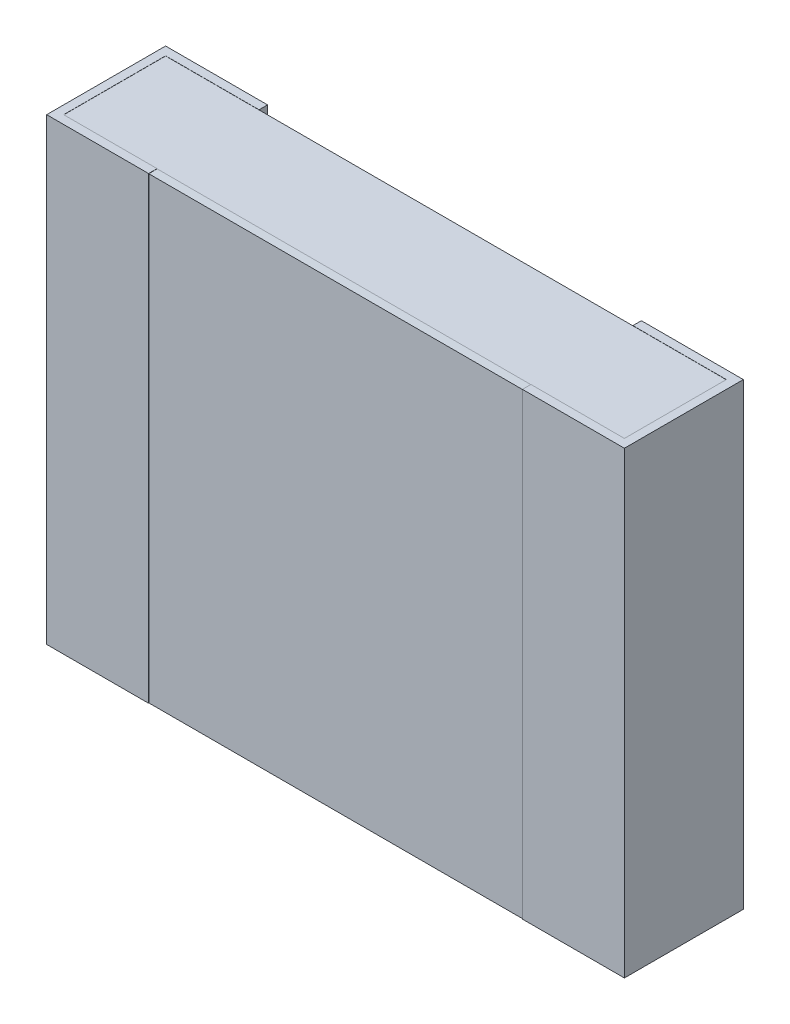
ISO-10303-21;
HEADER;
FILE_DESCRIPTION(('STEP AP214'),'2;1');
FILE_NAME('part.step','',(''),(''),'','','');
FILE_SCHEMA(('AUTOMOTIVE_DESIGN { 1 0 10303 214 1 1 1 1 }'));
ENDSEC;
DATA;
#1=APPLICATION_CONTEXT('core data for automotive mechanical design processes');
#2=APPLICATION_PROTOCOL_DEFINITION('international standard','automotive_design',2000,#1);
#3=PRODUCT_CONTEXT('',#1,'mechanical');
#4=PRODUCT('Part','Part','',(#3));
#5=PRODUCT_RELATED_PRODUCT_CATEGORY('part','',(#4));
#6=PRODUCT_DEFINITION_FORMATION('','',#4);
#7=PRODUCT_DEFINITION_CONTEXT('part definition',#1,'design');
#8=PRODUCT_DEFINITION('design','',#6,#7);
#9=PRODUCT_DEFINITION_SHAPE('','',#8);
#10=(LENGTH_UNIT() NAMED_UNIT(*) SI_UNIT(.MILLI.,.METRE.));
#11=(NAMED_UNIT(*) PLANE_ANGLE_UNIT() SI_UNIT($,.RADIAN.));
#12=(NAMED_UNIT(*) SI_UNIT($,.STERADIAN.) SOLID_ANGLE_UNIT());
#13=UNCERTAINTY_MEASURE_WITH_UNIT(LENGTH_MEASURE(1.E-05),#10,'distance_accuracy_value','');
#14=(GEOMETRIC_REPRESENTATION_CONTEXT(3) GLOBAL_UNCERTAINTY_ASSIGNED_CONTEXT((#13)) GLOBAL_UNIT_ASSIGNED_CONTEXT((#10,
#11,#12)) REPRESENTATION_CONTEXT('',''));
#15=CARTESIAN_POINT('',(0.,0.,0.));
#16=DIRECTION('',(0.,0.,1.));
#17=DIRECTION('',(1.,0.,0.));
#18=AXIS2_PLACEMENT_3D('',#15,#16,#17);
#19=CARTESIAN_POINT('',(-400000.,1.35,0.699999999995));
#20=DIRECTION('',(0.,0.,-1.));
#21=DIRECTION('',(-1.,0.,0.));
#22=AXIS2_PLACEMENT_3D('',#19,#20,#21);
#23=PLANE('',#22);
#24=DIRECTION('',(0.,1.,0.));
#25=VECTOR('',#24,1.);
#26=CARTESIAN_POINT('',(1.700000000028,1.35,0.699999999994816));
#27=LINE('',#26,#25);
#28=CARTESIAN_POINT('',(1.700000000028,-1.35,0.699999999994877));
#29=VERTEX_POINT('',#28);
#30=CARTESIAN_POINT('',(1.700000000028,1.35,0.699999999994877));
#31=VERTEX_POINT('',#30);
#32=EDGE_CURVE('E303',#29,#31,#27,.T.);
#33=ORIENTED_EDGE('',*,*,#32,.T.);
#34=DIRECTION('',(-1.,0.,0.));
#35=VECTOR('',#34,1.);
#36=CARTESIAN_POINT('',(-400000.,1.35,0.699999999995));
#37=LINE('',#36,#35);
#38=CARTESIAN_POINT('',(1.10000000000803,1.35,0.699999999994877));
#39=VERTEX_POINT('',#38);
#40=EDGE_CURVE('E154',#39,#31,#37,.F.);
#41=ORIENTED_EDGE('',*,*,#40,.F.);
#42=DIRECTION('',(0.,1.,0.));
#43=VECTOR('',#42,1.);
#44=CARTESIAN_POINT('',(1.100000000008,1.35,0.699999999994816));
#45=LINE('',#44,#43);
#46=CARTESIAN_POINT('',(1.10000000000803,-1.35,0.699999999994877));
#47=VERTEX_POINT('',#46);
#48=EDGE_CURVE('E242',#39,#47,#45,.F.);
#49=ORIENTED_EDGE('',*,*,#48,.T.);
#50=DIRECTION('',(-1.,0.,0.));
#51=VECTOR('',#50,1.);
#52=CARTESIAN_POINT('',(-400000.,-1.35,0.699999999995));
#53=LINE('',#52,#51);
#54=EDGE_CURVE('E161',#29,#47,#53,.T.);
#55=ORIENTED_EDGE('',*,*,#54,.F.);
#56=EDGE_LOOP('',(#33,#41,#49,#55));
#57=FACE_BOUND('',#56,.T.);
#58=ADVANCED_FACE('F17',(#57),#23,.F.);
#59=CARTESIAN_POINT('',(1.100000000008,1.35,291599.965));
#60=DIRECTION('',(1.,0.,0.));
#61=DIRECTION('',(0.,0.,-1.));
#62=AXIS2_PLACEMENT_3D('',#59,#60,#61);
#63=PLANE('',#62);
#64=DIRECTION('',(0.,1.,0.));
#65=VECTOR('',#64,1.);
#66=CARTESIAN_POINT('',(1.10000000000809,1.348,0.698999999997));
#67=LINE('',#66,#65);
#68=CARTESIAN_POINT('',(1.10000000000801,1.34851000000005,0.698999999997171));
#69=VERTEX_POINT('',#68);
#70=CARTESIAN_POINT('',(1.1000000001028,-1.34851000000004,0.698999999997114));
#71=VERTEX_POINT('',#70);
#72=EDGE_CURVE('E200',#69,#71,#67,.F.);
#73=ORIENTED_EDGE('',*,*,#72,.T.);
#74=DIRECTION('',(0.,0.00999950003953646,0.999950003749667));
#75=VECTOR('',#74,1.);
#76=CARTESIAN_POINT('',(1.100000000008,-1.349,0.650000000007367));
#77=LINE('',#76,#75);
#78=CARTESIAN_POINT('',(1.10000000000805,-1.349,0.650000000007));
#79=VERTEX_POINT('',#78);
#80=EDGE_CURVE('E206',#79,#71,#77,.T.);
#81=ORIENTED_EDGE('',*,*,#80,.F.);
#82=DIRECTION('',(0.,1.,0.));
#83=VECTOR('',#82,1.);
#84=CARTESIAN_POINT('',(1.10000000000809,1.35,0.650000000007));
#85=LINE('',#84,#83);
#86=CARTESIAN_POINT('',(1.10000000000805,-1.35,0.650000000007092));
#87=VERTEX_POINT('',#86);
#88=EDGE_CURVE('E288',#87,#79,#85,.T.);
#89=ORIENTED_EDGE('',*,*,#88,.F.);
#90=DIRECTION('',(0.,0.,-1.));
#91=VECTOR('',#90,1.);
#92=CARTESIAN_POINT('',(1.100000000008,-1.35,291599.965));
#93=LINE('',#92,#91);
#94=EDGE_CURVE('E244',#47,#87,#93,.T.);
#95=ORIENTED_EDGE('',*,*,#94,.F.);
#96=ORIENTED_EDGE('',*,*,#48,.F.);
#97=DIRECTION('',(0.,0.,-1.));
#98=VECTOR('',#97,1.);
#99=CARTESIAN_POINT('',(1.100000000008,1.35,291599.965));
#100=LINE('',#99,#98);
#101=CARTESIAN_POINT('',(1.10000000000807,1.35,0.650000000007092));
#102=VERTEX_POINT('',#101);
#103=EDGE_CURVE('E147',#102,#39,#100,.F.);
#104=ORIENTED_EDGE('',*,*,#103,.F.);
#105=DIRECTION('',(0.,1.,0.));
#106=VECTOR('',#105,1.);
#107=CARTESIAN_POINT('',(1.10000000000809,1.35,0.650000000007));
#108=LINE('',#107,#106);
#109=CARTESIAN_POINT('',(1.10000000000805,1.349,0.650000000007));
#110=VERTEX_POINT('',#109);
#111=EDGE_CURVE('E20',#110,#102,#108,.T.);
#112=ORIENTED_EDGE('',*,*,#111,.F.);
#113=DIRECTION('',(0.,0.00999950003954089,-0.999950003749667));
#114=VECTOR('',#113,1.);
#115=CARTESIAN_POINT('',(1.100000000008,1.34851,0.698999999997341));
#116=LINE('',#115,#114);
#117=EDGE_CURVE('E197',#69,#110,#116,.T.);
#118=ORIENTED_EDGE('',*,*,#117,.F.);
#119=EDGE_LOOP('',(#73,#81,#89,#95,#96,#104,#112,#118));
#120=FACE_BOUND('',#119,.T.);
#121=ADVANCED_FACE('F199',(#120),#63,.F.);
#122=CARTESIAN_POINT('',(-1.100000000008,1.35,291599.965));
#123=DIRECTION('',(-1.,0.,0.));
#124=DIRECTION('',(0.,0.,1.));
#125=AXIS2_PLACEMENT_3D('',#122,#123,#124);
#126=PLANE('',#125);
#127=DIRECTION('',(0.,-0.00999950003954089,0.999950003749667));
#128=VECTOR('',#127,1.);
#129=CARTESIAN_POINT('',(-1.100000000008,1.349,0.650000000007367));
#130=LINE('',#129,#128);
#131=CARTESIAN_POINT('',(-1.10000000000805,1.349,0.650000000007));
#132=VERTEX_POINT('',#131);
#133=CARTESIAN_POINT('',(-1.100000000008,1.34851,0.698999999997341));
#134=VERTEX_POINT('',#133);
#135=EDGE_CURVE('E219',#132,#134,#130,.T.);
#136=ORIENTED_EDGE('',*,*,#135,.F.);
#137=DIRECTION('',(0.,1.,0.));
#138=VECTOR('',#137,1.);
#139=CARTESIAN_POINT('',(-1.10000000000809,1.35,0.650000000007));
#140=LINE('',#139,#138);
#141=CARTESIAN_POINT('',(-1.10000000000805,1.35,0.650000000007092));
#142=VERTEX_POINT('',#141);
#143=EDGE_CURVE('E281',#142,#132,#140,.F.);
#144=ORIENTED_EDGE('',*,*,#143,.F.);
#145=DIRECTION('',(0.,0.,1.));
#146=VECTOR('',#145,1.);
#147=CARTESIAN_POINT('',(-1.100000000008,1.35,291599.965));
#148=LINE('',#147,#146);
#149=CARTESIAN_POINT('',(-1.10000000000806,1.35,0.699999999994939));
#150=VERTEX_POINT('',#149);
#151=EDGE_CURVE('E284',#150,#142,#148,.F.);
#152=ORIENTED_EDGE('',*,*,#151,.F.);
#153=DIRECTION('',(0.,1.,0.));
#154=VECTOR('',#153,1.);
#155=CARTESIAN_POINT('',(-1.10000000000809,1.35,0.699999999995));
#156=LINE('',#155,#154);
#157=CARTESIAN_POINT('',(-1.10000000000806,-1.35,0.699999999994939));
#158=VERTEX_POINT('',#157);
#159=EDGE_CURVE('E314',#150,#158,#156,.F.);
#160=ORIENTED_EDGE('',*,*,#159,.T.);
#161=DIRECTION('',(0.,0.,1.));
#162=VECTOR('',#161,1.);
#163=CARTESIAN_POINT('',(-1.100000000008,-1.35,291599.965));
#164=LINE('',#163,#162);
#165=CARTESIAN_POINT('',(-1.10000000000805,-1.35,0.650000000007092));
#166=VERTEX_POINT('',#165);
#167=EDGE_CURVE('E287',#166,#158,#164,.T.);
#168=ORIENTED_EDGE('',*,*,#167,.F.);
#169=DIRECTION('',(0.,1.,0.));
#170=VECTOR('',#169,1.);
#171=CARTESIAN_POINT('',(-1.10000000000809,1.35,0.650000000007));
#172=LINE('',#171,#170);
#173=CARTESIAN_POINT('',(-1.10000000000805,-1.349,0.650000000007));
#174=VERTEX_POINT('',#173);
#175=EDGE_CURVE('E285',#174,#166,#172,.F.);
#176=ORIENTED_EDGE('',*,*,#175,.F.);
#177=DIRECTION('',(0.,-0.00999950003953646,-0.999950003749667));
#178=VECTOR('',#177,1.);
#179=CARTESIAN_POINT('',(-1.100000000008,-1.34851,0.698999999997341));
#180=LINE('',#179,#178);
#181=CARTESIAN_POINT('',(-1.10000000000805,-1.34851000000001,0.69899999999717));
#182=VERTEX_POINT('',#181);
#183=EDGE_CURVE('E205',#182,#174,#180,.T.);
#184=ORIENTED_EDGE('',*,*,#183,.F.);
#185=DIRECTION('',(0.,1.,0.));
#186=VECTOR('',#185,1.);
#187=CARTESIAN_POINT('',(-1.10000000000809,1.348,0.698999999997));
#188=LINE('',#187,#186);
#189=EDGE_CURVE('E215',#182,#134,#188,.T.);
#190=ORIENTED_EDGE('',*,*,#189,.T.);
#191=EDGE_LOOP('',(#136,#144,#152,#160,#168,#176,#184,#190));
#192=FACE_BOUND('',#191,.T.);
#193=ADVANCED_FACE('F376',(#192),#126,.F.);
#194=CARTESIAN_POINT('',(-400000.,1.35,0.699999999995));
#195=DIRECTION('',(0.,0.,-1.));
#196=DIRECTION('',(-1.,0.,0.));
#197=AXIS2_PLACEMENT_3D('',#194,#195,#196);
#198=PLANE('',#197);
#199=ORIENTED_EDGE('',*,*,#159,.F.);
#200=DIRECTION('',(-1.,0.,0.));
#201=VECTOR('',#200,1.);
#202=CARTESIAN_POINT('',(-400000.,1.35,0.699999999995));
#203=LINE('',#202,#201);
#204=CARTESIAN_POINT('',(-1.700000000028,1.35,0.699999999994939));
#205=VERTEX_POINT('',#204);
#206=EDGE_CURVE('E317',#205,#150,#203,.F.);
#207=ORIENTED_EDGE('',*,*,#206,.F.);
#208=DIRECTION('',(0.,1.,0.));
#209=VECTOR('',#208,1.);
#210=CARTESIAN_POINT('',(-1.700000000028,1.35,0.699999999994816));
#211=LINE('',#210,#209);
#212=CARTESIAN_POINT('',(-1.700000000028,-1.35,0.699999999994877));
#213=VERTEX_POINT('',#212);
#214=EDGE_CURVE('E319',#205,#213,#211,.F.);
#215=ORIENTED_EDGE('',*,*,#214,.T.);
#216=DIRECTION('',(-1.,0.,0.));
#217=VECTOR('',#216,1.);
#218=CARTESIAN_POINT('',(-400000.,-1.35,0.699999999995));
#219=LINE('',#218,#217);
#220=EDGE_CURVE('E180',#158,#213,#219,.T.);
#221=ORIENTED_EDGE('',*,*,#220,.F.);
#222=EDGE_LOOP('',(#199,#207,#215,#221));
#223=FACE_BOUND('',#222,.T.);
#224=ADVANCED_FACE('F806',(#223),#198,.F.);
#225=CARTESIAN_POINT('',(1.700000000028,1.35,291599.965));
#226=DIRECTION('',(-1.,0.,0.));
#227=DIRECTION('',(0.,0.,1.));
#228=AXIS2_PLACEMENT_3D('',#225,#226,#227);
#229=PLANE('',#228);
#230=DIRECTION('',(0.,1.,0.));
#231=VECTOR('',#230,1.);
#232=CARTESIAN_POINT('',(1.70000000002801,1.35,0.));
#233=LINE('',#232,#231);
#234=CARTESIAN_POINT('',(1.700000000028,-1.35,0.));
#235=VERTEX_POINT('',#234);
#236=CARTESIAN_POINT('',(1.700000000028,1.35,0.));
#237=VERTEX_POINT('',#236);
#238=EDGE_CURVE('E278',#235,#237,#233,.T.);
#239=ORIENTED_EDGE('',*,*,#238,.T.);
#240=DIRECTION('',(0.,0.,1.));
#241=VECTOR('',#240,1.);
#242=CARTESIAN_POINT('',(1.700000000028,1.35,291599.965));
#243=LINE('',#242,#241);
#244=EDGE_CURVE('E305',#31,#237,#243,.F.);
#245=ORIENTED_EDGE('',*,*,#244,.F.);
#246=ORIENTED_EDGE('',*,*,#32,.F.);
#247=DIRECTION('',(0.,0.,1.));
#248=VECTOR('',#247,1.);
#249=CARTESIAN_POINT('',(1.700000000028,-1.35,291599.965));
#250=LINE('',#249,#248);
#251=EDGE_CURVE('E216',#235,#29,#250,.T.);
#252=ORIENTED_EDGE('',*,*,#251,.F.);
#253=EDGE_LOOP('',(#239,#245,#246,#252));
#254=FACE_BOUND('',#253,.T.);
#255=ADVANCED_FACE('F755',(#254),#229,.F.);
#256=CARTESIAN_POINT('',(-400000.,1.348,0.698999999997));
#257=DIRECTION('',(0.,0.,-1.));
#258=DIRECTION('',(-1.,0.,0.));
#259=AXIS2_PLACEMENT_3D('',#256,#257,#258);
#260=PLANE('',#259);
#261=DIRECTION('',(1.,0.,0.));
#262=VECTOR('',#261,1.);
#263=CARTESIAN_POINT('',(-400000.,-1.3485100000001,0.698999999997001));
#264=LINE('',#263,#262);
#265=EDGE_CURVE('E214',#71,#182,#264,.F.);
#266=ORIENTED_EDGE('',*,*,#265,.F.);
#267=ORIENTED_EDGE('',*,*,#72,.F.);
#268=DIRECTION('',(1.,0.,0.));
#269=VECTOR('',#268,1.);
#270=CARTESIAN_POINT('',(-1.100000000025,1.3485100000001,0.698999999997001));
#271=LINE('',#270,#269);
#272=EDGE_CURVE('E212',#69,#134,#271,.F.);
#273=ORIENTED_EDGE('',*,*,#272,.T.);
#274=ORIENTED_EDGE('',*,*,#189,.F.);
#275=EDGE_LOOP('',(#266,#267,#273,#274));
#276=FACE_BOUND('',#275,.T.);
#277=ADVANCED_FACE('F210',(#276),#260,.F.);
#278=CARTESIAN_POINT('',(-1.700000000028,1.35,291599.965));
#279=DIRECTION('',(1.,0.,0.));
#280=DIRECTION('',(0.,0.,-1.));
#281=AXIS2_PLACEMENT_3D('',#278,#279,#280);
#282=PLANE('',#281);
#283=ORIENTED_EDGE('',*,*,#214,.F.);
#284=DIRECTION('',(0.,0.,-1.));
#285=VECTOR('',#284,1.);
#286=CARTESIAN_POINT('',(-1.700000000028,1.35,0.650000000007));
#287=LINE('',#286,#285);
#288=CARTESIAN_POINT('',(-1.70000000002801,1.35,0.));
#289=VERTEX_POINT('',#288);
#290=EDGE_CURVE('E263',#205,#289,#287,.T.);
#291=ORIENTED_EDGE('',*,*,#290,.T.);
#292=DIRECTION('',(0.,1.,0.));
#293=VECTOR('',#292,1.);
#294=CARTESIAN_POINT('',(-1.70000000002801,1.35,0.));
#295=LINE('',#294,#293);
#296=CARTESIAN_POINT('',(-1.700000000028,-1.35,0.));
#297=VERTEX_POINT('',#296);
#298=EDGE_CURVE('E406',#289,#297,#295,.F.);
#299=ORIENTED_EDGE('',*,*,#298,.T.);
#300=DIRECTION('',(0.,0.,-1.));
#301=VECTOR('',#300,1.);
#302=CARTESIAN_POINT('',(-1.700000000028,-1.35,291599.965));
#303=LINE('',#302,#301);
#304=EDGE_CURVE('E280',#213,#297,#303,.T.);
#305=ORIENTED_EDGE('',*,*,#304,.F.);
#306=EDGE_LOOP('',(#283,#291,#299,#305));
#307=FACE_BOUND('',#306,.T.);
#308=ADVANCED_FACE('F556',(#307),#282,.F.);
#309=CARTESIAN_POINT('',(-1.649999999984,1.35,291599.965));
#310=DIRECTION('',(-1.,0.,0.));
#311=DIRECTION('',(0.,0.,1.));
#312=AXIS2_PLACEMENT_3D('',#309,#310,#311);
#313=PLANE('',#312);
#314=DIRECTION('',(0.,0.,1.));
#315=VECTOR('',#314,1.);
#316=CARTESIAN_POINT('',(-1.649999999984,-1.349,0.04999999998745));
#317=LINE('',#316,#315);
#318=CARTESIAN_POINT('',(-1.649999999984,-1.349,0.0499999999874495));
#319=VERTEX_POINT('',#318);
#320=CARTESIAN_POINT('',(-1.649999999984,-1.349,0.650000000007183));
#321=VERTEX_POINT('',#320);
#322=EDGE_CURVE('E387',#319,#321,#317,.T.);
#323=ORIENTED_EDGE('',*,*,#322,.T.);
#324=DIRECTION('',(0.,1.,0.));
#325=VECTOR('',#324,1.);
#326=CARTESIAN_POINT('',(-1.649999999984,1.35,0.650000000007367));
#327=LINE('',#326,#325);
#328=CARTESIAN_POINT('',(-1.649999999984,-1.35,0.650000000007183));
#329=VERTEX_POINT('',#328);
#330=EDGE_CURVE('E237',#321,#329,#327,.F.);
#331=ORIENTED_EDGE('',*,*,#330,.T.);
#332=DIRECTION('',(0.,0.,-1.));
#333=VECTOR('',#332,1.);
#334=CARTESIAN_POINT('',(-1.649999999984,-1.35,0.650000000007));
#335=LINE('',#334,#333);
#336=CARTESIAN_POINT('',(-1.649999999984,-1.35,0.0499999999874495));
#337=VERTEX_POINT('',#336);
#338=EDGE_CURVE('E399',#337,#329,#335,.F.);
#339=ORIENTED_EDGE('',*,*,#338,.F.);
#340=DIRECTION('',(0.,1.,0.));
#341=VECTOR('',#340,1.);
#342=CARTESIAN_POINT('',(-1.649999999984,1.35,0.049999999987449));
#343=LINE('',#342,#341);
#344=EDGE_CURVE('E264',#337,#319,#343,.T.);
#345=ORIENTED_EDGE('',*,*,#344,.T.);
#346=EDGE_LOOP('',(#323,#331,#339,#345));
#347=FACE_BOUND('',#346,.T.);
#348=ADVANCED_FACE('F554',(#347),#313,.F.);
#349=CARTESIAN_POINT('',(-400000.,1.35,0.650000000007));
#350=DIRECTION('',(0.,0.,1.));
#351=DIRECTION('',(1.,0.,0.));
#352=AXIS2_PLACEMENT_3D('',#349,#350,#351);
#353=PLANE('',#352);
#354=DIRECTION('',(1.,0.,0.));
#355=VECTOR('',#354,1.);
#356=CARTESIAN_POINT('',(-1.649999999984,-1.349,0.650000000007));
#357=LINE('',#356,#355);
#358=EDGE_CURVE('E382',#321,#174,#357,.T.);
#359=ORIENTED_EDGE('',*,*,#358,.T.);
#360=ORIENTED_EDGE('',*,*,#175,.T.);
#361=DIRECTION('',(1.,0.,0.));
#362=VECTOR('',#361,1.);
#363=CARTESIAN_POINT('',(-1.649999999984,-1.35,0.650000000007));
#364=LINE('',#363,#362);
#365=EDGE_CURVE('E403',#329,#166,#364,.T.);
#366=ORIENTED_EDGE('',*,*,#365,.F.);
#367=ORIENTED_EDGE('',*,*,#330,.F.);
#368=EDGE_LOOP('',(#359,#360,#366,#367));
#369=FACE_BOUND('',#368,.T.);
#370=ADVANCED_FACE('F383',(#369),#353,.F.);
#371=CARTESIAN_POINT('',(-400000.,-1.349,0.650000000007));
#372=DIRECTION('',(0.,-0.999950003749688,0.00999950003749088));
#373=DIRECTION('',(0.,-0.00999950003749088,-0.999950003749688));
#374=AXIS2_PLACEMENT_3D('',#371,#372,#373);
#375=PLANE('',#374);
#376=ORIENTED_EDGE('',*,*,#183,.T.);
#377=DIRECTION('',(1.,0.,0.));
#378=VECTOR('',#377,1.);
#379=CARTESIAN_POINT('',(-1.649999999984,-1.349,0.650000000007));
#380=LINE('',#379,#378);
#381=EDGE_CURVE('E374',#174,#79,#380,.T.);
#382=ORIENTED_EDGE('',*,*,#381,.T.);
#383=ORIENTED_EDGE('',*,*,#80,.T.);
#384=ORIENTED_EDGE('',*,*,#265,.T.);
#385=EDGE_LOOP('',(#376,#382,#383,#384));
#386=FACE_BOUND('',#385,.T.);
#387=ADVANCED_FACE('F372',(#386),#375,.T.);
#388=CARTESIAN_POINT('',(-400000.,1.35,0.650000000007));
#389=DIRECTION('',(0.,0.,1.));
#390=DIRECTION('',(1.,0.,0.));
#391=AXIS2_PLACEMENT_3D('',#388,#389,#390);
#392=PLANE('',#391);
#393=DIRECTION('',(1.,0.,0.));
#394=VECTOR('',#393,1.);
#395=CARTESIAN_POINT('',(-1.649999999984,-1.349,0.650000000007));
#396=LINE('',#395,#394);
#397=CARTESIAN_POINT('',(1.64999999998386,-1.349,0.650000000007));
#398=VERTEX_POINT('',#397);
#399=EDGE_CURVE('E391',#79,#398,#396,.T.);
#400=ORIENTED_EDGE('',*,*,#399,.T.);
#401=DIRECTION('',(0.,1.,0.));
#402=VECTOR('',#401,1.);
#403=CARTESIAN_POINT('',(1.64999999998372,1.35,0.650000000007));
#404=LINE('',#403,#402);
#405=CARTESIAN_POINT('',(1.64999999998386,-1.35,0.650000000007));
#406=VERTEX_POINT('',#405);
#407=EDGE_CURVE('E236',#398,#406,#404,.F.);
#408=ORIENTED_EDGE('',*,*,#407,.T.);
#409=DIRECTION('',(1.,0.,0.));
#410=VECTOR('',#409,1.);
#411=CARTESIAN_POINT('',(1.649999999984,-1.35,0.650000000007));
#412=LINE('',#411,#410);
#413=EDGE_CURVE('E332',#87,#406,#412,.T.);
#414=ORIENTED_EDGE('',*,*,#413,.F.);
#415=ORIENTED_EDGE('',*,*,#88,.T.);
#416=EDGE_LOOP('',(#400,#408,#414,#415));
#417=FACE_BOUND('',#416,.T.);
#418=ADVANCED_FACE('F624',(#417),#392,.F.);
#419=CARTESIAN_POINT('',(1.649999999984,1.35,291599.965));
#420=DIRECTION('',(1.,0.,0.));
#421=DIRECTION('',(0.,0.,-1.));
#422=AXIS2_PLACEMENT_3D('',#419,#420,#421);
#423=PLANE('',#422);
#424=DIRECTION('',(0.,0.,1.));
#425=VECTOR('',#424,1.);
#426=CARTESIAN_POINT('',(1.649999999984,-1.349,0.04999999998745));
#427=LINE('',#426,#425);
#428=CARTESIAN_POINT('',(1.649999999984,-1.349,0.0499999999874495));
#429=VERTEX_POINT('',#428);
#430=EDGE_CURVE('E393',#398,#429,#427,.F.);
#431=ORIENTED_EDGE('',*,*,#430,.T.);
#432=DIRECTION('',(0.,1.,0.));
#433=VECTOR('',#432,1.);
#434=CARTESIAN_POINT('',(1.649999999984,1.35,0.049999999987449));
#435=LINE('',#434,#433);
#436=CARTESIAN_POINT('',(1.649999999984,-1.35,0.0499999999874495));
#437=VERTEX_POINT('',#436);
#438=EDGE_CURVE('E272',#429,#437,#435,.F.);
#439=ORIENTED_EDGE('',*,*,#438,.T.);
#440=DIRECTION('',(0.,0.,-1.));
#441=VECTOR('',#440,1.);
#442=CARTESIAN_POINT('',(1.649999999984,-1.35,0.04999999998745));
#443=LINE('',#442,#441);
#444=EDGE_CURVE('E334',#406,#437,#443,.T.);
#445=ORIENTED_EDGE('',*,*,#444,.F.);
#446=ORIENTED_EDGE('',*,*,#407,.F.);
#447=EDGE_LOOP('',(#431,#439,#445,#446));
#448=FACE_BOUND('',#447,.T.);
#449=ADVANCED_FACE('F621',(#448),#423,.F.);
#450=CARTESIAN_POINT('',(-400000.,1.35,0.));
#451=DIRECTION('',(0.,0.,1.));
#452=DIRECTION('',(1.,0.,0.));
#453=AXIS2_PLACEMENT_3D('',#450,#451,#452);
#454=PLANE('',#453);
#455=DIRECTION('',(0.,1.,0.));
#456=VECTOR('',#455,1.);
#457=CARTESIAN_POINT('',(1.100000000008,1.35,0.));
#458=LINE('',#457,#456);
#459=CARTESIAN_POINT('',(1.100000000008,-1.35,0.));
#460=VERTEX_POINT('',#459);
#461=CARTESIAN_POINT('',(1.100000000008,1.35,0.));
#462=VERTEX_POINT('',#461);
#463=EDGE_CURVE('E451',#460,#462,#458,.T.);
#464=ORIENTED_EDGE('',*,*,#463,.T.);
#465=DIRECTION('',(1.,0.,0.));
#466=VECTOR('',#465,1.);
#467=CARTESIAN_POINT('',(1.649999999984,1.35,0.));
#468=LINE('',#467,#466);
#469=EDGE_CURVE('E275',#462,#237,#468,.T.);
#470=ORIENTED_EDGE('',*,*,#469,.T.);
#471=ORIENTED_EDGE('',*,*,#238,.F.);
#472=DIRECTION('',(1.,0.,0.));
#473=VECTOR('',#472,1.);
#474=CARTESIAN_POINT('',(1.649999999984,-1.35,0.));
#475=LINE('',#474,#473);
#476=EDGE_CURVE('E335',#460,#235,#475,.T.);
#477=ORIENTED_EDGE('',*,*,#476,.F.);
#478=EDGE_LOOP('',(#464,#470,#471,#477));
#479=FACE_BOUND('',#478,.T.);
#480=ADVANCED_FACE('F536',(#479),#454,.F.);
#481=CARTESIAN_POINT('',(1.649999999984,1.35,0.04999999998745));
#482=DIRECTION('',(0.,-1.,0.));
#483=DIRECTION('',(0.,0.,-1.));
#484=AXIS2_PLACEMENT_3D('',#481,#482,#483);
#485=PLANE('',#484);
#486=DIRECTION('',(0.,0.,-1.));
#487=VECTOR('',#486,1.);
#488=CARTESIAN_POINT('',(1.649999999984,1.35,291599.965));
#489=LINE('',#488,#487);
#490=CARTESIAN_POINT('',(1.64999999998379,1.35,0.0499999999968143));
#491=VERTEX_POINT('',#490);
#492=CARTESIAN_POINT('',(1.64999999998379,1.35,0.650000000007092));
#493=VERTEX_POINT('',#492);
#494=EDGE_CURVE('E269',#491,#493,#489,.F.);
#495=ORIENTED_EDGE('',*,*,#494,.T.);
#496=DIRECTION('',(1.,0.,0.));
#497=VECTOR('',#496,1.);
#498=CARTESIAN_POINT('',(-400000.,1.35,0.650000000007));
#499=LINE('',#498,#497);
#500=EDGE_CURVE('E221',#493,#102,#499,.F.);
#501=ORIENTED_EDGE('',*,*,#500,.T.);
#502=ORIENTED_EDGE('',*,*,#103,.T.);
#503=ORIENTED_EDGE('',*,*,#40,.T.);
#504=ORIENTED_EDGE('',*,*,#244,.T.);
#505=ORIENTED_EDGE('',*,*,#469,.F.);
#506=DIRECTION('',(0.,0.,-1.));
#507=VECTOR('',#506,1.);
#508=CARTESIAN_POINT('',(1.100000000008,1.35,291599.965));
#509=LINE('',#508,#507);
#510=CARTESIAN_POINT('',(1.10000000000807,1.35,0.0499999999968143));
#511=VERTEX_POINT('',#510);
#512=EDGE_CURVE('E260',#462,#511,#509,.F.);
#513=ORIENTED_EDGE('',*,*,#512,.T.);
#514=DIRECTION('',(-1.,0.,0.));
#515=VECTOR('',#514,1.);
#516=CARTESIAN_POINT('',(-400000.,1.35,0.05000000004429));
#517=LINE('',#516,#515);
#518=EDGE_CURVE('E227',#511,#491,#517,.F.);
#519=ORIENTED_EDGE('',*,*,#518,.T.);
#520=EDGE_LOOP('',(#495,#501,#502,#503,#504,#505,#513,#519));
#521=FACE_BOUND('',#520,.T.);
#522=ADVANCED_FACE('F526',(#521),#485,.F.);
#523=CARTESIAN_POINT('',(-400000.,1.35,0.05000000004429));
#524=DIRECTION('',(0.,0.,-1.));
#525=DIRECTION('',(-1.,0.,0.));
#526=AXIS2_PLACEMENT_3D('',#523,#524,#525);
#527=PLANE('',#526);
#528=DIRECTION('',(1.,0.,0.));
#529=VECTOR('',#528,1.);
#530=CARTESIAN_POINT('',(-1.649999999984,-1.349,0.04999999998745));
#531=LINE('',#530,#529);
#532=CARTESIAN_POINT('',(1.10000000000805,-1.349,0.0499999999936931));
#533=VERTEX_POINT('',#532);
#534=EDGE_CURVE('E454',#429,#533,#531,.F.);
#535=ORIENTED_EDGE('',*,*,#534,.T.);
#536=DIRECTION('',(0.,1.,0.));
#537=VECTOR('',#536,1.);
#538=CARTESIAN_POINT('',(1.10000000000809,1.35,0.0499999999999362));
#539=LINE('',#538,#537);
#540=CARTESIAN_POINT('',(1.10000000000805,-1.35,0.0499999999905713));
#541=VERTEX_POINT('',#540);
#542=EDGE_CURVE('E253',#533,#541,#539,.F.);
#543=ORIENTED_EDGE('',*,*,#542,.T.);
#544=DIRECTION('',(1.,0.,0.));
#545=VECTOR('',#544,1.);
#546=CARTESIAN_POINT('',(1.649999999984,-1.35,0.04999999998745));
#547=LINE('',#546,#545);
#548=EDGE_CURVE('E274',#437,#541,#547,.F.);
#549=ORIENTED_EDGE('',*,*,#548,.F.);
#550=ORIENTED_EDGE('',*,*,#438,.F.);
#551=EDGE_LOOP('',(#535,#543,#549,#550));
#552=FACE_BOUND('',#551,.T.);
#553=ADVANCED_FACE('F541',(#552),#527,.F.);
#554=CARTESIAN_POINT('',(1.649999999984,-1.35,0.04999999998745));
#555=DIRECTION('',(0.,-1.,0.));
#556=DIRECTION('',(0.,0.,-1.));
#557=AXIS2_PLACEMENT_3D('',#554,#555,#556);
#558=PLANE('',#557);
#559=ORIENTED_EDGE('',*,*,#413,.T.);
#560=ORIENTED_EDGE('',*,*,#444,.T.);
#561=ORIENTED_EDGE('',*,*,#548,.T.);
#562=DIRECTION('',(0.,0.,-1.));
#563=VECTOR('',#562,1.);
#564=CARTESIAN_POINT('',(1.100000000008,-1.35,291599.965));
#565=LINE('',#564,#563);
#566=EDGE_CURVE('E256',#541,#460,#565,.T.);
#567=ORIENTED_EDGE('',*,*,#566,.T.);
#568=ORIENTED_EDGE('',*,*,#476,.T.);
#569=ORIENTED_EDGE('',*,*,#251,.T.);
#570=ORIENTED_EDGE('',*,*,#54,.T.);
#571=ORIENTED_EDGE('',*,*,#94,.T.);
#572=EDGE_LOOP('',(#559,#560,#561,#567,#568,#569,#570,#571));
#573=FACE_BOUND('',#572,.T.);
#574=ADVANCED_FACE('F539',(#573),#558,.T.);
#575=CARTESIAN_POINT('',(-400000.,1.35,0.05000000004429));
#576=DIRECTION('',(0.,0.,-1.));
#577=DIRECTION('',(-1.,0.,0.));
#578=AXIS2_PLACEMENT_3D('',#575,#576,#577);
#579=PLANE('',#578);
#580=DIRECTION('',(0.,1.,0.));
#581=VECTOR('',#580,1.);
#582=CARTESIAN_POINT('',(1.64999999998372,1.35,0.0499999999999361));
#583=LINE('',#582,#581);
#584=CARTESIAN_POINT('',(1.64999999998393,1.349,0.049999999993693));
#585=VERTEX_POINT('',#584);
#586=EDGE_CURVE('E224',#585,#491,#583,.T.);
#587=ORIENTED_EDGE('',*,*,#586,.T.);
#588=ORIENTED_EDGE('',*,*,#518,.F.);
#589=DIRECTION('',(0.,1.,0.));
#590=VECTOR('',#589,1.);
#591=CARTESIAN_POINT('',(1.10000000000809,1.35,0.0499999999999362));
#592=LINE('',#591,#590);
#593=CARTESIAN_POINT('',(1.10000000000809,1.349,0.0499999999936931));
#594=VERTEX_POINT('',#593);
#595=EDGE_CURVE('E257',#511,#594,#592,.F.);
#596=ORIENTED_EDGE('',*,*,#595,.T.);
#597=DIRECTION('',(1.,0.,0.));
#598=VECTOR('',#597,1.);
#599=CARTESIAN_POINT('',(-1.649999999984,1.349,0.04999999998745));
#600=LINE('',#599,#598);
#601=EDGE_CURVE('E514',#585,#594,#600,.F.);
#602=ORIENTED_EDGE('',*,*,#601,.F.);
#603=EDGE_LOOP('',(#587,#588,#596,#602));
#604=FACE_BOUND('',#603,.T.);
#605=ADVANCED_FACE('F609',(#604),#579,.F.);
#606=CARTESIAN_POINT('',(-1.649999999984,1.35,291599.965));
#607=DIRECTION('',(-1.,0.,0.));
#608=DIRECTION('',(0.,0.,1.));
#609=AXIS2_PLACEMENT_3D('',#606,#607,#608);
#610=PLANE('',#609);
#611=DIRECTION('',(0.,1.,0.));
#612=VECTOR('',#611,1.);
#613=CARTESIAN_POINT('',(-1.649999999984,1.35,0.049999999987449));
#614=LINE('',#613,#612);
#615=CARTESIAN_POINT('',(-1.649999999984,1.349,0.0499999999874495));
#616=VERTEX_POINT('',#615);
#617=CARTESIAN_POINT('',(-1.649999999984,1.35,0.0499999999874495));
#618=VERTEX_POINT('',#617);
#619=EDGE_CURVE('E261',#616,#618,#614,.T.);
#620=ORIENTED_EDGE('',*,*,#619,.T.);
#621=DIRECTION('',(0.,0.,-1.));
#622=VECTOR('',#621,1.);
#623=CARTESIAN_POINT('',(-1.649999999984,1.35,0.650000000007));
#624=LINE('',#623,#622);
#625=CARTESIAN_POINT('',(-1.649999999984,1.35,0.650000000007183));
#626=VERTEX_POINT('',#625);
#627=EDGE_CURVE('E418',#618,#626,#624,.F.);
#628=ORIENTED_EDGE('',*,*,#627,.T.);
#629=DIRECTION('',(0.,1.,0.));
#630=VECTOR('',#629,1.);
#631=CARTESIAN_POINT('',(-1.649999999984,1.35,0.650000000007367));
#632=LINE('',#631,#630);
#633=CARTESIAN_POINT('',(-1.649999999984,1.349,0.650000000007183));
#634=VERTEX_POINT('',#633);
#635=EDGE_CURVE('E222',#626,#634,#632,.F.);
#636=ORIENTED_EDGE('',*,*,#635,.T.);
#637=DIRECTION('',(0.,0.,1.));
#638=VECTOR('',#637,1.);
#639=CARTESIAN_POINT('',(-1.649999999984,1.349,0.04999999998745));
#640=LINE('',#639,#638);
#641=EDGE_CURVE('E442',#616,#634,#640,.T.);
#642=ORIENTED_EDGE('',*,*,#641,.F.);
#643=EDGE_LOOP('',(#620,#628,#636,#642));
#644=FACE_BOUND('',#643,.T.);
#645=ADVANCED_FACE('F605',(#644),#610,.F.);
#646=CARTESIAN_POINT('',(-400000.,1.35,0.650000000007));
#647=DIRECTION('',(0.,0.,1.));
#648=DIRECTION('',(1.,0.,0.));
#649=AXIS2_PLACEMENT_3D('',#646,#647,#648);
#650=PLANE('',#649);
#651=ORIENTED_EDGE('',*,*,#635,.F.);
#652=DIRECTION('',(1.,0.,0.));
#653=VECTOR('',#652,1.);
#654=CARTESIAN_POINT('',(-1.649999999984,1.35,0.650000000007));
#655=LINE('',#654,#653);
#656=EDGE_CURVE('E328',#626,#142,#655,.T.);
#657=ORIENTED_EDGE('',*,*,#656,.T.);
#658=ORIENTED_EDGE('',*,*,#143,.T.);
#659=DIRECTION('',(1.,0.,0.));
#660=VECTOR('',#659,1.);
#661=CARTESIAN_POINT('',(-1.649999999984,1.349,0.650000000007));
#662=LINE('',#661,#660);
#663=EDGE_CURVE('E439',#634,#132,#662,.T.);
#664=ORIENTED_EDGE('',*,*,#663,.F.);
#665=EDGE_LOOP('',(#651,#657,#658,#664));
#666=FACE_BOUND('',#665,.T.);
#667=ADVANCED_FACE('F602',(#666),#650,.F.);
#668=CARTESIAN_POINT('',(-1.100000000025,1.348,0.750000000007));
#669=DIRECTION('',(0.,-0.999950003749688,-0.00999950003749288));
#670=DIRECTION('',(0.,0.00999950003749288,-0.999950003749688));
#671=AXIS2_PLACEMENT_3D('',#668,#669,#670);
#672=PLANE('',#671);
#673=DIRECTION('',(1.,0.,0.));
#674=VECTOR('',#673,1.);
#675=CARTESIAN_POINT('',(-1.649999999984,1.349,0.650000000007));
#676=LINE('',#675,#674);
#677=EDGE_CURVE('E434',#132,#110,#676,.T.);
#678=ORIENTED_EDGE('',*,*,#677,.F.);
#679=ORIENTED_EDGE('',*,*,#135,.T.);
#680=ORIENTED_EDGE('',*,*,#272,.F.);
#681=ORIENTED_EDGE('',*,*,#117,.T.);
#682=EDGE_LOOP('',(#678,#679,#680,#681));
#683=FACE_BOUND('',#682,.T.);
#684=ADVANCED_FACE('F218',(#683),#672,.F.);
#685=CARTESIAN_POINT('',(-400000.,1.35,0.650000000007));
#686=DIRECTION('',(0.,0.,1.));
#687=DIRECTION('',(1.,0.,0.));
#688=AXIS2_PLACEMENT_3D('',#685,#686,#687);
#689=PLANE('',#688);
#690=ORIENTED_EDGE('',*,*,#111,.T.);
#691=ORIENTED_EDGE('',*,*,#500,.F.);
#692=DIRECTION('',(0.,1.,0.));
#693=VECTOR('',#692,1.);
#694=CARTESIAN_POINT('',(1.64999999998372,1.35,0.650000000007));
#695=LINE('',#694,#693);
#696=CARTESIAN_POINT('',(1.64999999998386,1.349,0.650000000007));
#697=VERTEX_POINT('',#696);
#698=EDGE_CURVE('E266',#493,#697,#695,.F.);
#699=ORIENTED_EDGE('',*,*,#698,.T.);
#700=DIRECTION('',(1.,0.,0.));
#701=VECTOR('',#700,1.);
#702=CARTESIAN_POINT('',(-1.649999999984,1.349,0.650000000007));
#703=LINE('',#702,#701);
#704=EDGE_CURVE('E432',#110,#697,#703,.T.);
#705=ORIENTED_EDGE('',*,*,#704,.F.);
#706=EDGE_LOOP('',(#690,#691,#699,#705));
#707=FACE_BOUND('',#706,.T.);
#708=ADVANCED_FACE('F595',(#707),#689,.F.);
#709=CARTESIAN_POINT('',(1.649999999984,1.35,291599.965));
#710=DIRECTION('',(1.,0.,0.));
#711=DIRECTION('',(0.,0.,-1.));
#712=AXIS2_PLACEMENT_3D('',#709,#710,#711);
#713=PLANE('',#712);
#714=ORIENTED_EDGE('',*,*,#698,.F.);
#715=ORIENTED_EDGE('',*,*,#494,.F.);
#716=ORIENTED_EDGE('',*,*,#586,.F.);
#717=DIRECTION('',(0.,0.,1.));
#718=VECTOR('',#717,1.);
#719=CARTESIAN_POINT('',(1.649999999984,1.349,0.04999999998745));
#720=LINE('',#719,#718);
#721=EDGE_CURVE('E252',#697,#585,#720,.F.);
#722=ORIENTED_EDGE('',*,*,#721,.F.);
#723=EDGE_LOOP('',(#714,#715,#716,#722));
#724=FACE_BOUND('',#723,.T.);
#725=ADVANCED_FACE('F592',(#724),#713,.F.);
#726=CARTESIAN_POINT('',(-400000.,1.35,0.04999999993061));
#727=DIRECTION('',(0.,0.,-1.));
#728=DIRECTION('',(-1.,0.,0.));
#729=AXIS2_PLACEMENT_3D('',#726,#727,#728);
#730=PLANE('',#729);
#731=DIRECTION('',(1.,0.,0.));
#732=VECTOR('',#731,1.);
#733=CARTESIAN_POINT('',(-1.649999999984,-1.349,0.04999999998745));
#734=LINE('',#733,#732);
#735=CARTESIAN_POINT('',(-1.10000000000805,-1.349,0.0499999999812068));
#736=VERTEX_POINT('',#735);
#737=EDGE_CURVE('E398',#736,#319,#734,.F.);
#738=ORIENTED_EDGE('',*,*,#737,.T.);
#739=ORIENTED_EDGE('',*,*,#344,.F.);
#740=DIRECTION('',(1.,0.,0.));
#741=VECTOR('',#740,1.);
#742=CARTESIAN_POINT('',(-1.649999999984,-1.35,0.0499999999874501));
#743=LINE('',#742,#741);
#744=CARTESIAN_POINT('',(-1.10000000000802,-1.35,0.0499999999843279));
#745=VERTEX_POINT('',#744);
#746=EDGE_CURVE('E402',#745,#337,#743,.F.);
#747=ORIENTED_EDGE('',*,*,#746,.F.);
#748=DIRECTION('',(0.,1.,0.));
#749=VECTOR('',#748,1.);
#750=CARTESIAN_POINT('',(-1.10000000000809,1.35,0.0499999999749636));
#751=LINE('',#750,#749);
#752=EDGE_CURVE('E249',#745,#736,#751,.T.);
#753=ORIENTED_EDGE('',*,*,#752,.T.);
#754=EDGE_LOOP('',(#738,#739,#747,#753));
#755=FACE_BOUND('',#754,.T.);
#756=ADVANCED_FACE('F550',(#755),#730,.F.);
#757=CARTESIAN_POINT('',(-400000.,1.35,0.04999999993061));
#758=DIRECTION('',(0.,0.,-1.));
#759=DIRECTION('',(-1.,0.,0.));
#760=AXIS2_PLACEMENT_3D('',#757,#758,#759);
#761=PLANE('',#760);
#762=DIRECTION('',(0.,1.,0.));
#763=VECTOR('',#762,1.);
#764=CARTESIAN_POINT('',(-1.10000000000809,1.35,0.0499999999749636));
#765=LINE('',#764,#763);
#766=CARTESIAN_POINT('',(-1.10000000000805,1.349,0.0499999999812068));
#767=VERTEX_POINT('',#766);
#768=CARTESIAN_POINT('',(-1.10000000000802,1.35,0.0499999999843279));
#769=VERTEX_POINT('',#768);
#770=EDGE_CURVE('E34',#767,#769,#765,.T.);
#771=ORIENTED_EDGE('',*,*,#770,.T.);
#772=DIRECTION('',(1.,0.,0.));
#773=VECTOR('',#772,1.);
#774=CARTESIAN_POINT('',(-1.649999999984,1.35,0.0499999999874501));
#775=LINE('',#774,#773);
#776=EDGE_CURVE('E416',#769,#618,#775,.F.);
#777=ORIENTED_EDGE('',*,*,#776,.T.);
#778=ORIENTED_EDGE('',*,*,#619,.F.);
#779=DIRECTION('',(1.,0.,0.));
#780=VECTOR('',#779,1.);
#781=CARTESIAN_POINT('',(-1.649999999984,1.349,0.04999999998745));
#782=LINE('',#781,#780);
#783=EDGE_CURVE('E444',#767,#616,#782,.F.);
#784=ORIENTED_EDGE('',*,*,#783,.F.);
#785=EDGE_LOOP('',(#771,#777,#778,#784));
#786=FACE_BOUND('',#785,.T.);
#787=ADVANCED_FACE('F587',(#786),#761,.F.);
#788=CARTESIAN_POINT('',(-1.649999999984,1.35,0.650000000007));
#789=DIRECTION('',(0.,-1.,0.));
#790=DIRECTION('',(0.,0.,-1.));
#791=AXIS2_PLACEMENT_3D('',#788,#789,#790);
#792=PLANE('',#791);
#793=ORIENTED_EDGE('',*,*,#627,.F.);
#794=ORIENTED_EDGE('',*,*,#776,.F.);
#795=DIRECTION('',(0.,0.,1.));
#796=VECTOR('',#795,1.);
#797=CARTESIAN_POINT('',(-1.100000000008,1.35,291599.965));
#798=LINE('',#797,#796);
#799=CARTESIAN_POINT('',(-1.10000000000803,1.35,0.));
#800=VERTEX_POINT('',#799);
#801=EDGE_CURVE('E248',#769,#800,#798,.F.);
#802=ORIENTED_EDGE('',*,*,#801,.T.);
#803=DIRECTION('',(1.,0.,0.));
#804=VECTOR('',#803,1.);
#805=CARTESIAN_POINT('',(-400000.,1.35,0.));
#806=LINE('',#805,#804);
#807=EDGE_CURVE('E409',#800,#289,#806,.F.);
#808=ORIENTED_EDGE('',*,*,#807,.T.);
#809=ORIENTED_EDGE('',*,*,#290,.F.);
#810=ORIENTED_EDGE('',*,*,#206,.T.);
#811=ORIENTED_EDGE('',*,*,#151,.T.);
#812=ORIENTED_EDGE('',*,*,#656,.F.);
#813=EDGE_LOOP('',(#793,#794,#802,#808,#809,#810,#811,#812));
#814=FACE_BOUND('',#813,.T.);
#815=ADVANCED_FACE('F486',(#814),#792,.F.);
#816=CARTESIAN_POINT('',(-400000.,1.35,0.));
#817=DIRECTION('',(0.,0.,1.));
#818=DIRECTION('',(1.,0.,0.));
#819=AXIS2_PLACEMENT_3D('',#816,#817,#818);
#820=PLANE('',#819);
#821=ORIENTED_EDGE('',*,*,#298,.F.);
#822=ORIENTED_EDGE('',*,*,#807,.F.);
#823=DIRECTION('',(0.,1.,0.));
#824=VECTOR('',#823,1.);
#825=CARTESIAN_POINT('',(-1.100000000008,1.35,0.));
#826=LINE('',#825,#824);
#827=CARTESIAN_POINT('',(-1.100000000008,-1.35,0.));
#828=VERTEX_POINT('',#827);
#829=EDGE_CURVE('E476',#800,#828,#826,.F.);
#830=ORIENTED_EDGE('',*,*,#829,.T.);
#831=DIRECTION('',(1.,0.,0.));
#832=VECTOR('',#831,1.);
#833=CARTESIAN_POINT('',(-1.649999999984,-1.35,0.));
#834=LINE('',#833,#832);
#835=EDGE_CURVE('E405',#297,#828,#834,.T.);
#836=ORIENTED_EDGE('',*,*,#835,.F.);
#837=EDGE_LOOP('',(#821,#822,#830,#836));
#838=FACE_BOUND('',#837,.T.);
#839=ADVANCED_FACE('F491',(#838),#820,.F.);
#840=CARTESIAN_POINT('',(-1.649999999984,-1.35,0.650000000007));
#841=DIRECTION('',(0.,-1.,0.));
#842=DIRECTION('',(0.,0.,-1.));
#843=AXIS2_PLACEMENT_3D('',#840,#841,#842);
#844=PLANE('',#843);
#845=ORIENTED_EDGE('',*,*,#746,.T.);
#846=ORIENTED_EDGE('',*,*,#338,.T.);
#847=ORIENTED_EDGE('',*,*,#365,.T.);
#848=ORIENTED_EDGE('',*,*,#167,.T.);
#849=ORIENTED_EDGE('',*,*,#220,.T.);
#850=ORIENTED_EDGE('',*,*,#304,.T.);
#851=ORIENTED_EDGE('',*,*,#835,.T.);
#852=DIRECTION('',(0.,0.,1.));
#853=VECTOR('',#852,1.);
#854=CARTESIAN_POINT('',(-1.100000000008,-1.35,291599.965));
#855=LINE('',#854,#853);
#856=EDGE_CURVE('E479',#828,#745,#855,.T.);
#857=ORIENTED_EDGE('',*,*,#856,.T.);
#858=EDGE_LOOP('',(#845,#846,#847,#848,#849,#850,#851,#857));
#859=FACE_BOUND('',#858,.T.);
#860=ADVANCED_FACE('F552',(#859),#844,.T.);
#861=CARTESIAN_POINT('',(-1.649999999984,-1.349,0.04999999998745));
#862=DIRECTION('',(0.,1.,0.));
#863=DIRECTION('',(0.,0.,1.));
#864=AXIS2_PLACEMENT_3D('',#861,#862,#863);
#865=PLANE('',#864);
#866=ORIENTED_EDGE('',*,*,#430,.F.);
#867=ORIENTED_EDGE('',*,*,#399,.F.);
#868=ORIENTED_EDGE('',*,*,#381,.F.);
#869=ORIENTED_EDGE('',*,*,#358,.F.);
#870=ORIENTED_EDGE('',*,*,#322,.F.);
#871=ORIENTED_EDGE('',*,*,#737,.F.);
#872=DIRECTION('',(1.,0.,0.));
#873=VECTOR('',#872,1.);
#874=CARTESIAN_POINT('',(-400000.,-1.349,0.04999999998745));
#875=LINE('',#874,#873);
#876=EDGE_CURVE('E499',#736,#533,#875,.T.);
#877=ORIENTED_EDGE('',*,*,#876,.T.);
#878=ORIENTED_EDGE('',*,*,#534,.F.);
#879=EDGE_LOOP('',(#866,#867,#868,#869,#870,#871,#877,#878));
#880=FACE_BOUND('',#879,.T.);
#881=ADVANCED_FACE('F390',(#880),#865,.F.);
#882=CARTESIAN_POINT('',(1.100000000008,1.35,291599.965));
#883=DIRECTION('',(1.,0.,0.));
#884=DIRECTION('',(0.,0.,-1.));
#885=AXIS2_PLACEMENT_3D('',#882,#883,#884);
#886=PLANE('',#885);
#887=ORIENTED_EDGE('',*,*,#542,.F.);
#888=DIRECTION('',(0.,1.,0.));
#889=VECTOR('',#888,1.);
#890=CARTESIAN_POINT('',(1.10000000000809,1.35,0.04999999998745));
#891=LINE('',#890,#889);
#892=EDGE_CURVE('E502',#533,#594,#891,.T.);
#893=ORIENTED_EDGE('',*,*,#892,.T.);
#894=ORIENTED_EDGE('',*,*,#595,.F.);
#895=ORIENTED_EDGE('',*,*,#512,.F.);
#896=ORIENTED_EDGE('',*,*,#463,.F.);
#897=ORIENTED_EDGE('',*,*,#566,.F.);
#898=EDGE_LOOP('',(#887,#893,#894,#895,#896,#897));
#899=FACE_BOUND('',#898,.T.);
#900=ADVANCED_FACE('F531',(#899),#886,.F.);
#901=CARTESIAN_POINT('',(-1.649999999984,1.349,0.04999999998745));
#902=DIRECTION('',(0.,1.,0.));
#903=DIRECTION('',(0.,0.,1.));
#904=AXIS2_PLACEMENT_3D('',#901,#902,#903);
#905=PLANE('',#904);
#906=ORIENTED_EDGE('',*,*,#704,.T.);
#907=ORIENTED_EDGE('',*,*,#721,.T.);
#908=ORIENTED_EDGE('',*,*,#601,.T.);
#909=DIRECTION('',(1.,0.,0.));
#910=VECTOR('',#909,1.);
#911=CARTESIAN_POINT('',(-400000.,1.349,0.04999999998745));
#912=LINE('',#911,#910);
#913=EDGE_CURVE('E26',#594,#767,#912,.F.);
#914=ORIENTED_EDGE('',*,*,#913,.T.);
#915=ORIENTED_EDGE('',*,*,#783,.T.);
#916=ORIENTED_EDGE('',*,*,#641,.T.);
#917=ORIENTED_EDGE('',*,*,#663,.T.);
#918=ORIENTED_EDGE('',*,*,#677,.T.);
#919=EDGE_LOOP('',(#906,#907,#908,#914,#915,#916,#917,#918));
#920=FACE_BOUND('',#919,.T.);
#921=ADVANCED_FACE('F571',(#920),#905,.T.);
#922=CARTESIAN_POINT('',(-1.100000000008,1.35,291599.965));
#923=DIRECTION('',(-1.,0.,0.));
#924=DIRECTION('',(0.,0.,1.));
#925=AXIS2_PLACEMENT_3D('',#922,#923,#924);
#926=PLANE('',#925);
#927=ORIENTED_EDGE('',*,*,#829,.F.);
#928=ORIENTED_EDGE('',*,*,#801,.F.);
#929=ORIENTED_EDGE('',*,*,#770,.F.);
#930=DIRECTION('',(0.,1.,0.));
#931=VECTOR('',#930,1.);
#932=CARTESIAN_POINT('',(-1.10000000000809,1.35,0.04999999998745));
#933=LINE('',#932,#931);
#934=EDGE_CURVE('E11',#767,#736,#933,.F.);
#935=ORIENTED_EDGE('',*,*,#934,.T.);
#936=ORIENTED_EDGE('',*,*,#752,.F.);
#937=ORIENTED_EDGE('',*,*,#856,.F.);
#938=EDGE_LOOP('',(#927,#928,#929,#935,#936,#937));
#939=FACE_BOUND('',#938,.T.);
#940=ADVANCED_FACE('F495',(#939),#926,.F.);
#941=CARTESIAN_POINT('',(-400000.,1.35,0.04999999998745));
#942=DIRECTION('',(0.,0.,1.));
#943=DIRECTION('',(1.,0.,0.));
#944=AXIS2_PLACEMENT_3D('',#941,#942,#943);
#945=PLANE('',#944);
#946=ORIENTED_EDGE('',*,*,#913,.F.);
#947=ORIENTED_EDGE('',*,*,#892,.F.);
#948=ORIENTED_EDGE('',*,*,#876,.F.);
#949=ORIENTED_EDGE('',*,*,#934,.F.);
#950=EDGE_LOOP('',(#946,#947,#948,#949));
#951=FACE_BOUND('',#950,.T.);
#952=ADVANCED_FACE('F548',(#951),#945,.F.);
#953=CLOSED_SHELL('',(#58,#121,#193,#224,#255,#277,#308,#348,#370,#387,#418,#449,#480,#522,#553,
#574,#605,#645,#667,#684,#708,#725,#756,#787,#815,#839,#860,#881,#900,#921,#940,#952));
#954=MANIFOLD_SOLID_BREP('B1',#953);
#955=ADVANCED_BREP_SHAPE_REPRESENTATION('',(#18,#954),#14);
#956=SHAPE_DEFINITION_REPRESENTATION(#9,#955);
ENDSEC;
END-ISO-10303-21;
